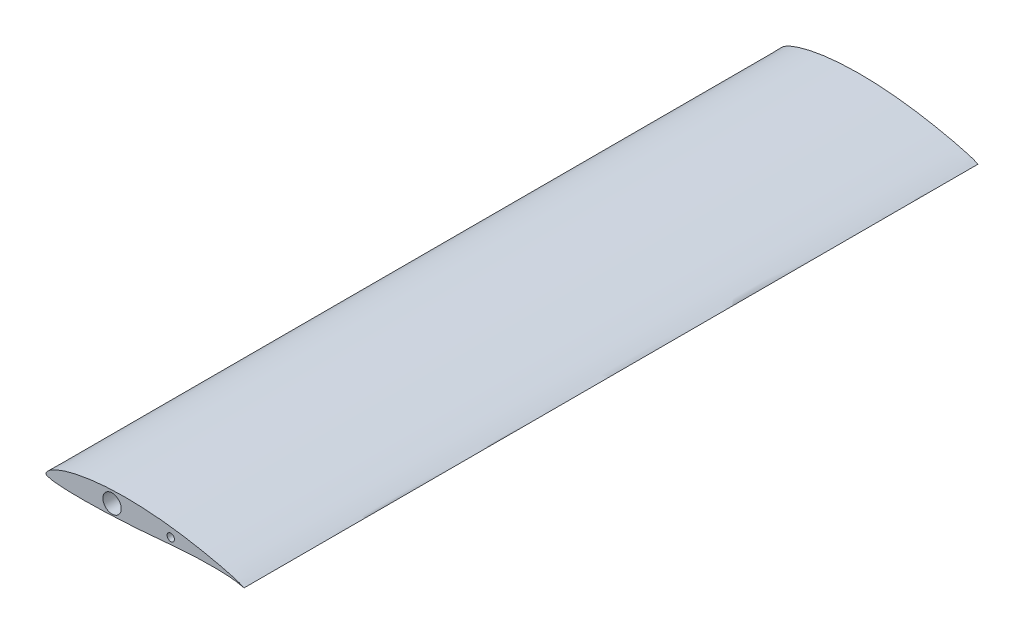
ISO-10303-21;
HEADER;
FILE_DESCRIPTION(('STEP AP214'),'2;1');
FILE_NAME('part.step','',(''),(''),'','','');
FILE_SCHEMA(('AUTOMOTIVE_DESIGN { 1 0 10303 214 1 1 1 1 }'));
ENDSEC;
DATA;
#1=APPLICATION_CONTEXT('core data for automotive mechanical design processes');
#2=APPLICATION_PROTOCOL_DEFINITION('international standard','automotive_design',2000,#1);
#3=PRODUCT_CONTEXT('',#1,'mechanical');
#4=PRODUCT('Part','Part','',(#3));
#5=PRODUCT_RELATED_PRODUCT_CATEGORY('part','',(#4));
#6=PRODUCT_DEFINITION_FORMATION('','',#4);
#7=PRODUCT_DEFINITION_CONTEXT('part definition',#1,'design');
#8=PRODUCT_DEFINITION('design','',#6,#7);
#9=PRODUCT_DEFINITION_SHAPE('','',#8);
#10=(LENGTH_UNIT() NAMED_UNIT(*) SI_UNIT(.MILLI.,.METRE.));
#11=(NAMED_UNIT(*) PLANE_ANGLE_UNIT() SI_UNIT($,.RADIAN.));
#12=(NAMED_UNIT(*) SI_UNIT($,.STERADIAN.) SOLID_ANGLE_UNIT());
#13=UNCERTAINTY_MEASURE_WITH_UNIT(LENGTH_MEASURE(1.E-05),#10,'distance_accuracy_value','');
#14=(GEOMETRIC_REPRESENTATION_CONTEXT(3) GLOBAL_UNCERTAINTY_ASSIGNED_CONTEXT((#13)) GLOBAL_UNIT_ASSIGNED_CONTEXT((#10,
#11,#12)) REPRESENTATION_CONTEXT('',''));
#15=CARTESIAN_POINT('',(0.,0.,0.));
#16=DIRECTION('',(0.,0.,1.));
#17=DIRECTION('',(1.,0.,0.));
#18=AXIS2_PLACEMENT_3D('',#15,#16,#17);
#19=CARTESIAN_POINT('',(270.,0.,1000.));
#20=CARTESIAN_POINT('',(269.997712349188,0.0234686611256753,1000.));
#21=CARTESIAN_POINT('',(268.237544940999,0.666521838597682,1000.));
#22=CARTESIAN_POINT('',(266.567167257241,1.46678966420109,1000.));
#23=CARTESIAN_POINT('',(262.675565234946,3.01541236049875,1000.));
#24=CARTESIAN_POINT('',(257.913204906047,4.57241999430303,1000.));
#25=CARTESIAN_POINT('',(251.73204691059,6.33251118051269,1000.));
#26=CARTESIAN_POINT('',(244.411227291845,8.23757547132939,1000.));
#27=CARTESIAN_POINT('',(235.957624235031,10.2728144558493,1000.));
#28=CARTESIAN_POINT('',(226.514158981901,12.3893388504072,1000.));
#29=CARTESIAN_POINT('',(216.193353242997,14.5408619660615,1000.));
#30=CARTESIAN_POINT('',(205.131334675445,16.6775446846104,1000.));
#31=CARTESIAN_POINT('',(193.456704411805,18.7297695998892,1000.));
#32=CARTESIAN_POINT('',(181.297741572979,20.6324475689059,1000.));
#33=CARTESIAN_POINT('',(168.767775931884,22.3116653675687,1000.));
#34=CARTESIAN_POINT('',(155.975282970602,23.7079240823725,1000.));
#35=CARTESIAN_POINT('',(143.035274216822,24.8048562112978,1000.));
#36=CARTESIAN_POINT('',(130.061683689652,25.5801941607533,1000.));
#37=CARTESIAN_POINT('',(117.173431648326,26.0002870023156,1000.));
#38=CARTESIAN_POINT('',(104.483656181065,26.0575961543031,1000.));
#39=CARTESIAN_POINT('',(92.1043755010552,25.7531475308751,1000.));
#40=CARTESIAN_POINT('',(80.1394774009738,25.0742351928149,1000.));
#41=CARTESIAN_POINT('',(68.6900371078556,24.0380742657958,1000.));
#42=CARTESIAN_POINT('',(57.8508881437444,22.6699130708634,1000.));
#43=CARTESIAN_POINT('',(47.7143437152034,21.012498661415,1000.));
#44=CARTESIAN_POINT('',(38.3731688496213,19.0872173409911,1000.));
#45=CARTESIAN_POINT('',(29.9084239228661,16.9557577669825,1000.));
#46=CARTESIAN_POINT('',(22.3989734163653,14.6443999986465,1000.));
#47=CARTESIAN_POINT('',(15.9079033402757,12.2158951402086,1000.));
#48=CARTESIAN_POINT('',(10.4843260994342,9.72016383184442,1000.));
#49=CARTESIAN_POINT('',(6.17701570310239,7.22086075585639,1000.));
#50=CARTESIAN_POINT('',(2.96116420805311,4.74120142257406,1000.));
#51=CARTESIAN_POINT('',(0.976626840598714,2.42611562982906,1000.));
#52=CARTESIAN_POINT('',(0.0237044844557384,0.790715423622603,1000.));
#53=CARTESIAN_POINT('',(-0.0162040088825778,-0.469721469617103,1000.));
#54=CARTESIAN_POINT('',(0.800260735100484,-1.83607096740891,1000.));
#55=CARTESIAN_POINT('',(3.49214110344745,-2.62953771203089,1000.));
#56=CARTESIAN_POINT('',(7.30797165240786,-3.66267648937733,1000.));
#57=CARTESIAN_POINT('',(12.6565956454472,-4.39911743413203,1000.));
#58=CARTESIAN_POINT('',(19.3193886145286,-5.03288942314606,1000.));
#59=CARTESIAN_POINT('',(27.2905068620494,-5.46979820264928,1000.));
#60=CARTESIAN_POINT('',(36.4621699832966,-5.73867476423236,1000.));
#61=CARTESIAN_POINT('',(46.7414412352293,-5.84000525497753,1000.));
#62=CARTESIAN_POINT('',(58.0104590527028,-5.77015970140565,1000.));
#63=CARTESIAN_POINT('',(70.1433505727269,-5.53682953906036,1000.));
#64=CARTESIAN_POINT('',(83.0071440525755,-5.14081230033932,1000.));
#65=CARTESIAN_POINT('',(96.4628511642711,-4.56590673235837,1000.));
#66=CARTESIAN_POINT('',(110.37398366241,-3.8270098283305,1000.));
#67=CARTESIAN_POINT('',(124.616655035357,-2.89299856695057,1000.));
#68=CARTESIAN_POINT('',(139.099460234209,-1.73634558064927,1000.));
#69=CARTESIAN_POINT('',(153.734791933855,-0.400812922822165,1000.));
#70=CARTESIAN_POINT('',(168.40973375314,0.892284934259414,1000.));
#71=CARTESIAN_POINT('',(182.933903609888,2.04143507217637,1000.));
#72=CARTESIAN_POINT('',(197.078170060053,2.95921503400767,1000.));
#73=CARTESIAN_POINT('',(210.604377411182,3.57903703483429,1000.));
#74=CARTESIAN_POINT('',(223.266715876022,3.87437613460032,1000.));
#75=CARTESIAN_POINT('',(234.840539210252,3.81861077039356,1000.));
#76=CARTESIAN_POINT('',(245.04773169024,3.45329310537476,1000.));
#77=CARTESIAN_POINT('',(253.77858024118,2.76286493967301,1000.));
#78=CARTESIAN_POINT('',(260.440654454045,1.94222962723521,1000.));
#79=CARTESIAN_POINT('',(265.781454331532,0.929874856989155,1000.));
#80=CARTESIAN_POINT('',(267.932950880897,0.533749209448357,1000.));
#81=CARTESIAN_POINT('',(270.002416438342,-0.0247898727749039,1000.));
#82=CARTESIAN_POINT('',(270.,0.,1000.));
#83=B_SPLINE_CURVE_WITH_KNOTS('',3,(#19,#20,#21,#22,#23,#24,#25,#26,#27,#28,#29,#30,#31,#32,#33,
#34,#35,#36,#37,#38,#39,#40,#41,#42,#43,#44,#45,#46,#47,#48,#49,#50,#51,#52,#53,#54,#55,#56,#57,
#58,#59,#60,#61,#62,#63,#64,#65,#66,#67,#68,#69,#70,#71,#72,#73,#74,#75,#76,#77,#78,#79,#80,#81,
#82),.UNSPECIFIED.,.T.,.F.,(4,1,1,1,1,1,1,1,1,1,1,1,1,1,1,1,1,1,1,1,1,1,1,1,1,1,1,1,1,1,1,1,1,1,
1,1,1,1,1,1,1,1,1,1,1,1,1,1,1,1,1,1,1,1,1,1,1,1,1,1,1,4),(0.,0.00169352365364151,
0.00639544747949767,0.0134616508959298,0.0227535749736499,0.0343673071517184,0.0481910226954883,
0.064031392481717,0.0816806172414247,0.100894124121338,0.121431793819588,0.143025453493653,
0.165434010835678,0.188439038764568,0.211855124404938,0.235496289450678,0.259143745164546,
0.282614908314604,0.30570154453718,0.328231583662433,0.350030433806964,0.370943883213179,
0.390816528552158,0.409505873078083,0.426856550273814,0.442733384525219,0.457018387509693,
0.469615069942757,0.480449695456551,0.489471860268703,0.496730301180351,0.502329146614106,
0.506255660132997,0.506441944995434,0.509181515928635,0.513913846214958,0.521178418676576,
0.530944156675701,0.543144508951145,0.557669673966592,0.574383525920581,0.593109554408618,
0.613638211877394,0.635743557157375,0.659184094922803,0.683713689413154,0.709075753928382,
0.735036066440786,0.761429738598203,0.7881837663948,0.815056829999431,0.84164476376198,
0.867513560484753,0.892232408519161,0.915363656349594,0.936485324642643,0.955199831872162,
0.971104187426938,0.983751025641108,0.992812817585366,0.998211136302568,1.),.UNSPECIFIED.);
#84=DIRECTION('',(0.,0.,-1.));
#85=VECTOR('',#84,1.);
#86=SURFACE_OF_LINEAR_EXTRUSION('',#83,#85);
#87=CARTESIAN_POINT('',(270.,0.,1000.));
#88=VERTEX_POINT('',#87);
#89=EDGE_CURVE('E12',#88,#88,#83,.T.);
#90=ORIENTED_EDGE('',*,*,#89,.F.);
#91=EDGE_LOOP('',(#90));
#92=FACE_BOUND('',#91,.T.);
#93=CARTESIAN_POINT('',(270.,0.,0.));
#94=CARTESIAN_POINT('',(269.997712349188,0.0234686611256753,0.));
#95=CARTESIAN_POINT('',(268.237544940999,0.666521838597682,0.));
#96=CARTESIAN_POINT('',(266.567167257241,1.46678966420109,0.));
#97=CARTESIAN_POINT('',(262.675565234946,3.01541236049875,0.));
#98=CARTESIAN_POINT('',(257.913204906047,4.57241999430303,0.));
#99=CARTESIAN_POINT('',(251.73204691059,6.33251118051269,0.));
#100=CARTESIAN_POINT('',(244.411227291845,8.23757547132939,0.));
#101=CARTESIAN_POINT('',(235.957624235031,10.2728144558493,0.));
#102=CARTESIAN_POINT('',(226.514158981901,12.3893388504072,0.));
#103=CARTESIAN_POINT('',(216.193353242997,14.5408619660615,0.));
#104=CARTESIAN_POINT('',(205.131334675445,16.6775446846104,0.));
#105=CARTESIAN_POINT('',(193.456704411805,18.7297695998892,0.));
#106=CARTESIAN_POINT('',(181.297741572979,20.6324475689059,0.));
#107=CARTESIAN_POINT('',(168.767775931884,22.3116653675687,0.));
#108=CARTESIAN_POINT('',(155.975282970602,23.7079240823725,0.));
#109=CARTESIAN_POINT('',(143.035274216822,24.8048562112978,0.));
#110=CARTESIAN_POINT('',(130.061683689652,25.5801941607533,0.));
#111=CARTESIAN_POINT('',(117.173431648326,26.0002870023156,0.));
#112=CARTESIAN_POINT('',(104.483656181065,26.0575961543031,0.));
#113=CARTESIAN_POINT('',(92.1043755010552,25.7531475308751,0.));
#114=CARTESIAN_POINT('',(80.1394774009738,25.0742351928149,0.));
#115=CARTESIAN_POINT('',(68.6900371078556,24.0380742657958,0.));
#116=CARTESIAN_POINT('',(57.8508881437444,22.6699130708634,0.));
#117=CARTESIAN_POINT('',(47.7143437152034,21.012498661415,0.));
#118=CARTESIAN_POINT('',(38.3731688496213,19.0872173409911,0.));
#119=CARTESIAN_POINT('',(29.9084239228661,16.9557577669825,0.));
#120=CARTESIAN_POINT('',(22.3989734163653,14.6443999986465,0.));
#121=CARTESIAN_POINT('',(15.9079033402757,12.2158951402086,0.));
#122=CARTESIAN_POINT('',(10.4843260994342,9.72016383184442,0.));
#123=CARTESIAN_POINT('',(6.17701570310239,7.22086075585639,0.));
#124=CARTESIAN_POINT('',(2.96116420805311,4.74120142257406,0.));
#125=CARTESIAN_POINT('',(0.976626840598714,2.42611562982906,0.));
#126=CARTESIAN_POINT('',(0.0237044844557384,0.790715423622603,0.));
#127=CARTESIAN_POINT('',(-0.0162040088825778,-0.469721469617103,0.));
#128=CARTESIAN_POINT('',(0.800260735100484,-1.83607096740891,0.));
#129=CARTESIAN_POINT('',(3.49214110344745,-2.62953771203089,0.));
#130=CARTESIAN_POINT('',(7.30797165240786,-3.66267648937733,0.));
#131=CARTESIAN_POINT('',(12.6565956454472,-4.39911743413203,0.));
#132=CARTESIAN_POINT('',(19.3193886145286,-5.03288942314606,0.));
#133=CARTESIAN_POINT('',(27.2905068620494,-5.46979820264928,0.));
#134=CARTESIAN_POINT('',(36.4621699832966,-5.73867476423236,0.));
#135=CARTESIAN_POINT('',(46.7414412352293,-5.84000525497753,0.));
#136=CARTESIAN_POINT('',(58.0104590527028,-5.77015970140565,0.));
#137=CARTESIAN_POINT('',(70.1433505727269,-5.53682953906036,0.));
#138=CARTESIAN_POINT('',(83.0071440525755,-5.14081230033932,0.));
#139=CARTESIAN_POINT('',(96.4628511642711,-4.56590673235837,0.));
#140=CARTESIAN_POINT('',(110.37398366241,-3.8270098283305,0.));
#141=CARTESIAN_POINT('',(124.616655035357,-2.89299856695057,0.));
#142=CARTESIAN_POINT('',(139.099460234209,-1.73634558064927,0.));
#143=CARTESIAN_POINT('',(153.734791933855,-0.400812922822165,0.));
#144=CARTESIAN_POINT('',(168.40973375314,0.892284934259414,0.));
#145=CARTESIAN_POINT('',(182.933903609888,2.04143507217637,0.));
#146=CARTESIAN_POINT('',(197.078170060053,2.95921503400767,0.));
#147=CARTESIAN_POINT('',(210.604377411182,3.57903703483429,0.));
#148=CARTESIAN_POINT('',(223.266715876022,3.87437613460032,0.));
#149=CARTESIAN_POINT('',(234.840539210252,3.81861077039356,0.));
#150=CARTESIAN_POINT('',(245.04773169024,3.45329310537476,0.));
#151=CARTESIAN_POINT('',(253.77858024118,2.76286493967301,0.));
#152=CARTESIAN_POINT('',(260.440654454045,1.94222962723521,0.));
#153=CARTESIAN_POINT('',(265.781454331532,0.929874856989155,0.));
#154=CARTESIAN_POINT('',(267.932950880897,0.533749209448357,0.));
#155=CARTESIAN_POINT('',(270.002416438342,-0.0247898727749039,0.));
#156=CARTESIAN_POINT('',(270.,0.,0.));
#157=B_SPLINE_CURVE_WITH_KNOTS('',3,(#93,#94,#95,#96,#97,#98,#99,#100,#101,#102,#103,#104,#105,
#106,#107,#108,#109,#110,#111,#112,#113,#114,#115,#116,#117,#118,#119,#120,#121,#122,#123,#124,
#125,#126,#127,#128,#129,#130,#131,#132,#133,#134,#135,#136,#137,#138,#139,#140,#141,#142,#143,
#144,#145,#146,#147,#148,#149,#150,#151,#152,#153,#154,#155,#156),.UNSPECIFIED.,.T.,.F.,(4,1,1,
1,1,1,1,1,1,1,1,1,1,1,1,1,1,1,1,1,1,1,1,1,1,1,1,1,1,1,1,1,1,1,1,1,1,1,1,1,1,1,1,1,1,1,1,1,1,1,1,
1,1,1,1,1,1,1,1,1,1,4),(0.,0.00169352365364151,0.00639544747949767,0.0134616508959298,
0.0227535749736499,0.0343673071517184,0.0481910226954883,0.064031392481717,0.0816806172414247,
0.100894124121338,0.121431793819588,0.143025453493653,0.165434010835678,0.188439038764568,
0.211855124404938,0.235496289450678,0.259143745164546,0.282614908314604,0.30570154453718,
0.328231583662433,0.350030433806964,0.370943883213179,0.390816528552158,0.409505873078083,
0.426856550273814,0.442733384525219,0.457018387509693,0.469615069942757,0.480449695456551,
0.489471860268703,0.496730301180351,0.502329146614106,0.506255660132997,0.506441944995434,
0.509181515928635,0.513913846214958,0.521178418676576,0.530944156675701,0.543144508951145,
0.557669673966592,0.574383525920581,0.593109554408618,0.613638211877394,0.635743557157375,
0.659184094922803,0.683713689413154,0.709075753928382,0.735036066440786,0.761429738598203,
0.7881837663948,0.815056829999431,0.84164476376198,0.867513560484753,0.892232408519161,
0.915363656349594,0.936485324642643,0.955199831872162,0.971104187426938,0.983751025641108,
0.992812817585366,0.998211136302568,1.),.UNSPECIFIED.);
#158=CARTESIAN_POINT('',(270.,0.,0.));
#159=VERTEX_POINT('',#158);
#160=EDGE_CURVE('E51',#159,#159,#157,.T.);
#161=ORIENTED_EDGE('',*,*,#160,.T.);
#162=EDGE_LOOP('',(#161));
#163=FACE_BOUND('',#162,.T.);
#164=ADVANCED_FACE('F47',(#92,#163),#86,.F.);
#165=CARTESIAN_POINT('',(1.62332381853687,3.13497524933791,1000.));
#166=DIRECTION('',(0.,0.,-1.));
#167=DIRECTION('',(-1.,0.,0.));
#168=AXIS2_PLACEMENT_3D('',#165,#166,#167);
#169=PLANE('',#168);
#170=CARTESIAN_POINT('',(90.,9.60326732864512,1000.));
#171=DIRECTION('',(0.,0.,1.));
#172=DIRECTION('',(1.,0.,0.));
#173=AXIS2_PLACEMENT_3D('',#170,#171,#172);
#174=CIRCLE('',#173,12.5);
#175=CARTESIAN_POINT('',(102.5,9.60326732864512,1000.));
#176=VERTEX_POINT('',#175);
#177=EDGE_CURVE('E59',#176,#176,#174,.T.);
#178=ORIENTED_EDGE('',*,*,#177,.F.);
#179=EDGE_LOOP('',(#178));
#180=FACE_BOUND('',#179,.T.);
#181=CARTESIAN_POINT('',(170.,9.60326732864512,1000.));
#182=DIRECTION('',(0.,0.,1.));
#183=DIRECTION('',(1.,0.,0.));
#184=AXIS2_PLACEMENT_3D('',#181,#182,#183);
#185=CIRCLE('',#184,4.99999999999999);
#186=CARTESIAN_POINT('',(175.,9.60326732864512,1000.));
#187=VERTEX_POINT('',#186);
#188=EDGE_CURVE('E64',#187,#187,#185,.T.);
#189=ORIENTED_EDGE('',*,*,#188,.F.);
#190=EDGE_LOOP('',(#189));
#191=FACE_BOUND('',#190,.T.);
#192=ORIENTED_EDGE('',*,*,#89,.T.);
#193=EDGE_LOOP('',(#192));
#194=FACE_BOUND('',#193,.T.);
#195=ADVANCED_FACE('F82',(#180,#191,#194),#169,.F.);
#196=CARTESIAN_POINT('',(1.62332381853687,3.13497524933791,0.));
#197=DIRECTION('',(0.,0.,-1.));
#198=DIRECTION('',(-1.,0.,0.));
#199=AXIS2_PLACEMENT_3D('',#196,#197,#198);
#200=PLANE('',#199);
#201=CARTESIAN_POINT('',(90.,9.60326732864512,0.));
#202=DIRECTION('',(0.,0.,1.));
#203=DIRECTION('',(1.,0.,0.));
#204=AXIS2_PLACEMENT_3D('',#201,#202,#203);
#205=CIRCLE('',#204,12.5);
#206=CARTESIAN_POINT('',(102.5,9.60326732864512,0.));
#207=VERTEX_POINT('',#206);
#208=EDGE_CURVE('E73',#207,#207,#205,.T.);
#209=ORIENTED_EDGE('',*,*,#208,.T.);
#210=EDGE_LOOP('',(#209));
#211=FACE_BOUND('',#210,.T.);
#212=CARTESIAN_POINT('',(170.,9.60326732864512,0.));
#213=DIRECTION('',(0.,0.,1.));
#214=DIRECTION('',(1.,0.,0.));
#215=AXIS2_PLACEMENT_3D('',#212,#213,#214);
#216=CIRCLE('',#215,4.99999999999999);
#217=CARTESIAN_POINT('',(175.,9.60326732864512,0.));
#218=VERTEX_POINT('',#217);
#219=EDGE_CURVE('E70',#218,#218,#216,.T.);
#220=ORIENTED_EDGE('',*,*,#219,.T.);
#221=EDGE_LOOP('',(#220));
#222=FACE_BOUND('',#221,.T.);
#223=ORIENTED_EDGE('',*,*,#160,.F.);
#224=EDGE_LOOP('',(#223));
#225=FACE_BOUND('',#224,.T.);
#226=ADVANCED_FACE('F85',(#211,#222,#225),#200,.T.);
#227=CARTESIAN_POINT('',(170.,9.60326732864512,1000.));
#228=DIRECTION('',(0.,0.,-1.));
#229=DIRECTION('',(-1.,0.,0.));
#230=AXIS2_PLACEMENT_3D('',#227,#228,#229);
#231=CYLINDRICAL_SURFACE('',#230,4.99999999999999);
#232=ORIENTED_EDGE('',*,*,#188,.T.);
#233=EDGE_LOOP('',(#232));
#234=FACE_BOUND('',#233,.T.);
#235=ORIENTED_EDGE('',*,*,#219,.F.);
#236=EDGE_LOOP('',(#235));
#237=FACE_BOUND('',#236,.T.);
#238=ADVANCED_FACE('F89',(#234,#237),#231,.F.);
#239=CARTESIAN_POINT('',(90.,9.60326732864512,1000.));
#240=DIRECTION('',(0.,0.,-1.));
#241=DIRECTION('',(-1.,0.,0.));
#242=AXIS2_PLACEMENT_3D('',#239,#240,#241);
#243=CYLINDRICAL_SURFACE('',#242,12.5);
#244=ORIENTED_EDGE('',*,*,#177,.T.);
#245=EDGE_LOOP('',(#244));
#246=FACE_BOUND('',#245,.T.);
#247=ORIENTED_EDGE('',*,*,#208,.F.);
#248=EDGE_LOOP('',(#247));
#249=FACE_BOUND('',#248,.T.);
#250=ADVANCED_FACE('F79',(#246,#249),#243,.F.);
#251=CLOSED_SHELL('',(#164,#195,#226,#238,#250));
#252=MANIFOLD_SOLID_BREP('B2',#251);
#253=ADVANCED_BREP_SHAPE_REPRESENTATION('',(#18,#252),#14);
#254=SHAPE_DEFINITION_REPRESENTATION(#9,#253);
ENDSEC;
END-ISO-10303-21;
